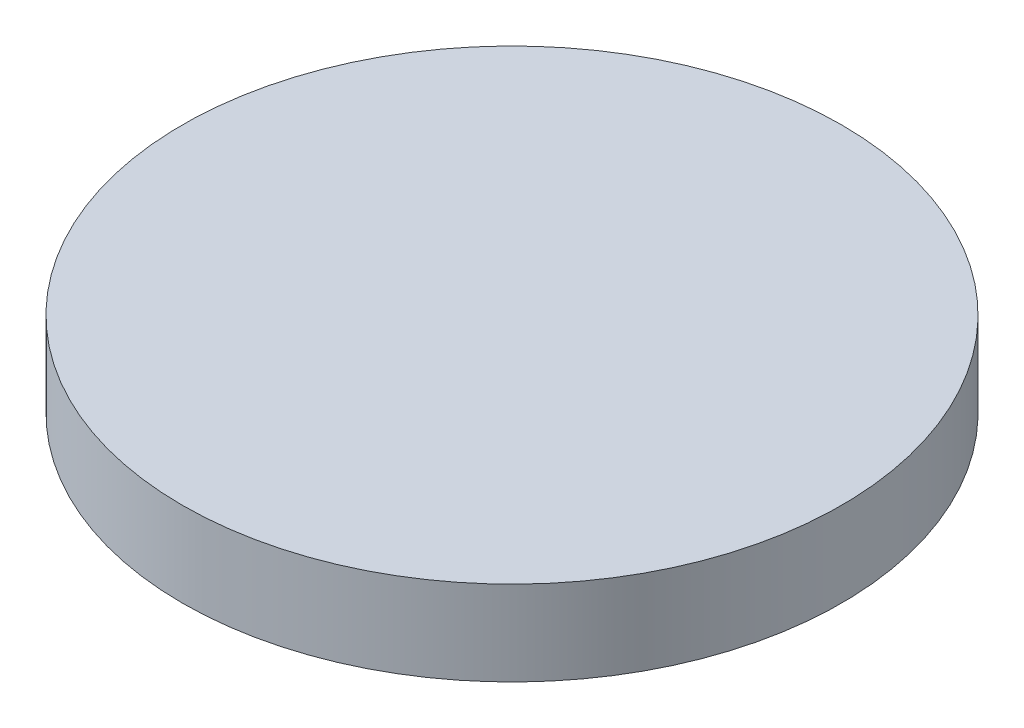
ISO-10303-21;
HEADER;
FILE_DESCRIPTION(('STEP AP214'),'2;1');
FILE_NAME('part.step','',(''),(''),'','','');
FILE_SCHEMA(('AUTOMOTIVE_DESIGN { 1 0 10303 214 1 1 1 1 }'));
ENDSEC;
DATA;
#1=APPLICATION_CONTEXT('core data for automotive mechanical design processes');
#2=APPLICATION_PROTOCOL_DEFINITION('international standard','automotive_design',2000,#1);
#3=PRODUCT_CONTEXT('',#1,'mechanical');
#4=PRODUCT('Part','Part','',(#3));
#5=PRODUCT_RELATED_PRODUCT_CATEGORY('part','',(#4));
#6=PRODUCT_DEFINITION_FORMATION('','',#4);
#7=PRODUCT_DEFINITION_CONTEXT('part definition',#1,'design');
#8=PRODUCT_DEFINITION('design','',#6,#7);
#9=PRODUCT_DEFINITION_SHAPE('','',#8);
#10=(LENGTH_UNIT() NAMED_UNIT(*) SI_UNIT(.MILLI.,.METRE.));
#11=(NAMED_UNIT(*) PLANE_ANGLE_UNIT() SI_UNIT($,.RADIAN.));
#12=(NAMED_UNIT(*) SI_UNIT($,.STERADIAN.) SOLID_ANGLE_UNIT());
#13=UNCERTAINTY_MEASURE_WITH_UNIT(LENGTH_MEASURE(1.E-05),#10,'distance_accuracy_value','');
#14=(GEOMETRIC_REPRESENTATION_CONTEXT(3) GLOBAL_UNCERTAINTY_ASSIGNED_CONTEXT((#13)) GLOBAL_UNIT_ASSIGNED_CONTEXT((#10,
#11,#12)) REPRESENTATION_CONTEXT('',''));
#15=CARTESIAN_POINT('',(0.,0.,0.));
#16=DIRECTION('',(0.,0.,1.));
#17=DIRECTION('',(1.,0.,0.));
#18=AXIS2_PLACEMENT_3D('',#15,#16,#17);
#19=CARTESIAN_POINT('',(0.,-3.,0.));
#20=DIRECTION('',(0.,1.,0.));
#21=DIRECTION('',(0.,0.,1.));
#22=AXIS2_PLACEMENT_3D('',#19,#20,#21);
#23=CYLINDRICAL_SURFACE('',#22,16.5);
#24=CARTESIAN_POINT('',(0.,-3.,0.));
#25=DIRECTION('',(0.,-1.,0.));
#26=DIRECTION('',(0.,0.,-1.));
#27=AXIS2_PLACEMENT_3D('',#24,#25,#26);
#28=CIRCLE('',#27,16.5);
#29=CARTESIAN_POINT('',(0.,-3.,-16.5));
#30=VERTEX_POINT('',#29);
#31=EDGE_CURVE('E300',#30,#30,#28,.T.);
#32=ORIENTED_EDGE('',*,*,#31,.T.);
#33=EDGE_LOOP('',(#32));
#34=FACE_BOUND('',#33,.T.);
#35=CARTESIAN_POINT('',(0.,0.,0.));
#36=DIRECTION('',(0.,-1.,0.));
#37=DIRECTION('',(0.,0.,-1.));
#38=AXIS2_PLACEMENT_3D('',#35,#36,#37);
#39=CIRCLE('',#38,16.5);
#40=CARTESIAN_POINT('',(16.4924225024706,0.,0.499999999999942));
#41=VERTEX_POINT('',#40);
#42=CARTESIAN_POINT('',(0.5,0.,16.4924225024706));
#43=VERTEX_POINT('',#42);
#44=EDGE_CURVE('E305',#41,#43,#39,.T.);
#45=ORIENTED_EDGE('',*,*,#44,.F.);
#46=DIRECTION('',(0.,1.,0.));
#47=VECTOR('',#46,1.);
#48=CARTESIAN_POINT('',(16.4924225024706,-3.,0.499999999999942));
#49=LINE('',#48,#47);
#50=CARTESIAN_POINT('',(16.4924225024706,-0.5,0.499999999999942));
#51=VERTEX_POINT('',#50);
#52=EDGE_CURVE('E234',#51,#41,#49,.T.);
#53=ORIENTED_EDGE('',*,*,#52,.F.);
#54=CARTESIAN_POINT('',(0.,-0.5,0.));
#55=DIRECTION('',(0.,-1.,0.));
#56=DIRECTION('',(-1.,0.,0.));
#57=AXIS2_PLACEMENT_3D('',#54,#55,#56);
#58=CIRCLE('',#57,16.5);
#59=CARTESIAN_POINT('',(16.4924225024706,-0.5,-0.500000000000058));
#60=VERTEX_POINT('',#59);
#61=EDGE_CURVE('E236',#60,#51,#58,.T.);
#62=ORIENTED_EDGE('',*,*,#61,.F.);
#63=DIRECTION('',(0.,1.,0.));
#64=VECTOR('',#63,1.);
#65=CARTESIAN_POINT('',(16.4924225024706,-3.,-0.500000000000058));
#66=LINE('',#65,#64);
#67=CARTESIAN_POINT('',(16.4924225024706,0.,-0.500000000000058));
#68=VERTEX_POINT('',#67);
#69=EDGE_CURVE('E227',#60,#68,#66,.T.);
#70=ORIENTED_EDGE('',*,*,#69,.T.);
#71=CARTESIAN_POINT('',(0.5,0.,-16.4924225024706));
#72=VERTEX_POINT('',#71);
#73=EDGE_CURVE('E70',#72,#68,#39,.T.);
#74=ORIENTED_EDGE('',*,*,#73,.F.);
#75=DIRECTION('',(0.,1.,0.));
#76=VECTOR('',#75,1.);
#77=CARTESIAN_POINT('',(0.5,-3.,-16.4924225024706));
#78=LINE('',#77,#76);
#79=CARTESIAN_POINT('',(0.5,-0.5,-16.4924225024706));
#80=VERTEX_POINT('',#79);
#81=EDGE_CURVE('E253',#80,#72,#78,.T.);
#82=ORIENTED_EDGE('',*,*,#81,.F.);
#83=CARTESIAN_POINT('',(0.,-0.5,0.));
#84=DIRECTION('',(0.,1.,0.));
#85=DIRECTION('',(0.,0.,1.));
#86=AXIS2_PLACEMENT_3D('',#83,#84,#85);
#87=CIRCLE('',#86,16.5);
#88=CARTESIAN_POINT('',(-0.5,-0.5,-16.4924225024706));
#89=VERTEX_POINT('',#88);
#90=EDGE_CURVE('E266',#80,#89,#87,.T.);
#91=ORIENTED_EDGE('',*,*,#90,.T.);
#92=DIRECTION('',(0.,1.,0.));
#93=VECTOR('',#92,1.);
#94=CARTESIAN_POINT('',(-0.5,-3.,-16.4924225024706));
#95=LINE('',#94,#93);
#96=CARTESIAN_POINT('',(-0.5,0.,-16.4924225024706));
#97=VERTEX_POINT('',#96);
#98=EDGE_CURVE('E263',#89,#97,#95,.T.);
#99=ORIENTED_EDGE('',*,*,#98,.T.);
#100=CARTESIAN_POINT('',(-16.4924225024706,0.,-0.499999999999942));
#101=VERTEX_POINT('',#100);
#102=EDGE_CURVE('E302',#101,#97,#39,.T.);
#103=ORIENTED_EDGE('',*,*,#102,.F.);
#104=DIRECTION('',(0.,1.,0.));
#105=VECTOR('',#104,1.);
#106=CARTESIAN_POINT('',(-16.4924225024706,-3.,-0.499999999999942));
#107=LINE('',#106,#105);
#108=CARTESIAN_POINT('',(-16.4924225024706,-0.5,-0.499999999999942));
#109=VERTEX_POINT('',#108);
#110=EDGE_CURVE('E205',#109,#101,#107,.T.);
#111=ORIENTED_EDGE('',*,*,#110,.F.);
#112=CARTESIAN_POINT('',(0.,-0.5,0.));
#113=DIRECTION('',(0.,1.,0.));
#114=DIRECTION('',(1.,0.,0.));
#115=AXIS2_PLACEMENT_3D('',#112,#113,#114);
#116=CIRCLE('',#115,16.5);
#117=CARTESIAN_POINT('',(-16.4924225024706,-0.5,0.500000000000058));
#118=VERTEX_POINT('',#117);
#119=EDGE_CURVE('E211',#109,#118,#116,.T.);
#120=ORIENTED_EDGE('',*,*,#119,.T.);
#121=DIRECTION('',(0.,1.,0.));
#122=VECTOR('',#121,1.);
#123=CARTESIAN_POINT('',(-16.4924225024706,-3.,0.500000000000058));
#124=LINE('',#123,#122);
#125=CARTESIAN_POINT('',(-16.4924225024706,0.,0.500000000000058));
#126=VERTEX_POINT('',#125);
#127=EDGE_CURVE('E209',#118,#126,#124,.T.);
#128=ORIENTED_EDGE('',*,*,#127,.T.);
#129=CARTESIAN_POINT('',(-0.5,0.,16.4924225024706));
#130=VERTEX_POINT('',#129);
#131=EDGE_CURVE('E65',#130,#126,#39,.T.);
#132=ORIENTED_EDGE('',*,*,#131,.F.);
#133=DIRECTION('',(0.,1.,0.));
#134=VECTOR('',#133,1.);
#135=CARTESIAN_POINT('',(-0.5,-3.,16.4924225024706));
#136=LINE('',#135,#134);
#137=CARTESIAN_POINT('',(-0.5,-0.5,16.4924225024706));
#138=VERTEX_POINT('',#137);
#139=EDGE_CURVE('E293',#138,#130,#136,.T.);
#140=ORIENTED_EDGE('',*,*,#139,.F.);
#141=CARTESIAN_POINT('',(0.,-0.5,0.));
#142=DIRECTION('',(0.,-1.,0.));
#143=DIRECTION('',(0.,0.,-1.));
#144=AXIS2_PLACEMENT_3D('',#141,#142,#143);
#145=CIRCLE('',#144,16.5);
#146=CARTESIAN_POINT('',(0.5,-0.5,16.4924225024706));
#147=VERTEX_POINT('',#146);
#148=EDGE_CURVE('E12',#147,#138,#145,.T.);
#149=ORIENTED_EDGE('',*,*,#148,.F.);
#150=DIRECTION('',(0.,1.,0.));
#151=VECTOR('',#150,1.);
#152=CARTESIAN_POINT('',(0.5,-3.,16.4924225024706));
#153=LINE('',#152,#151);
#154=EDGE_CURVE('E285',#147,#43,#153,.T.);
#155=ORIENTED_EDGE('',*,*,#154,.T.);
#156=EDGE_LOOP('',(#45,#53,#62,#70,#74,#82,#91,#99,#103,#111,#120,#128,#132,#140,#149,#155));
#157=FACE_BOUND('',#156,.T.);
#158=ADVANCED_FACE('F61',(#34,#157),#23,.F.);
#159=CARTESIAN_POINT('',(0.,1.5,0.));
#160=DIRECTION('',(0.,-1.,0.));
#161=DIRECTION('',(0.,0.,-1.));
#162=AXIS2_PLACEMENT_3D('',#159,#160,#161);
#163=CYLINDRICAL_SURFACE('',#162,17.5);
#164=CARTESIAN_POINT('',(0.,-3.,0.));
#165=DIRECTION('',(0.,-1.,0.));
#166=DIRECTION('',(0.,0.,-1.));
#167=AXIS2_PLACEMENT_3D('',#164,#165,#166);
#168=CIRCLE('',#167,17.5);
#169=CARTESIAN_POINT('',(0.,-3.,-17.5));
#170=VERTEX_POINT('',#169);
#171=EDGE_CURVE('E295',#170,#170,#168,.T.);
#172=ORIENTED_EDGE('',*,*,#171,.F.);
#173=EDGE_LOOP('',(#172));
#174=FACE_BOUND('',#173,.T.);
#175=CARTESIAN_POINT('',(0.,1.5,0.));
#176=DIRECTION('',(0.,1.,0.));
#177=DIRECTION('',(0.,0.,1.));
#178=AXIS2_PLACEMENT_3D('',#175,#176,#177);
#179=CIRCLE('',#178,17.5);
#180=CARTESIAN_POINT('',(0.,1.5,17.5));
#181=VERTEX_POINT('',#180);
#182=EDGE_CURVE('E269',#181,#181,#179,.T.);
#183=ORIENTED_EDGE('',*,*,#182,.F.);
#184=EDGE_LOOP('',(#183));
#185=FACE_BOUND('',#184,.T.);
#186=ADVANCED_FACE('F366',(#174,#185),#163,.T.);
#187=CARTESIAN_POINT('',(0.,1.5,0.));
#188=DIRECTION('',(0.,1.,0.));
#189=DIRECTION('',(0.,0.,1.));
#190=AXIS2_PLACEMENT_3D('',#187,#188,#189);
#191=PLANE('',#190);
#192=ORIENTED_EDGE('',*,*,#182,.T.);
#193=EDGE_LOOP('',(#192));
#194=FACE_BOUND('',#193,.T.);
#195=ADVANCED_FACE('F63',(#194),#191,.T.);
#196=CARTESIAN_POINT('',(0.,-3.,0.));
#197=DIRECTION('',(0.,-1.,0.));
#198=DIRECTION('',(0.,0.,-1.));
#199=AXIS2_PLACEMENT_3D('',#196,#197,#198);
#200=PLANE('',#199);
#201=ORIENTED_EDGE('',*,*,#171,.T.);
#202=EDGE_LOOP('',(#201));
#203=FACE_BOUND('',#202,.T.);
#204=ORIENTED_EDGE('',*,*,#31,.F.);
#205=EDGE_LOOP('',(#204));
#206=FACE_BOUND('',#205,.T.);
#207=ADVANCED_FACE('F378',(#203,#206),#200,.T.);
#208=CARTESIAN_POINT('',(0.,0.,0.));
#209=DIRECTION('',(0.,1.,0.));
#210=DIRECTION('',(0.,0.,1.));
#211=AXIS2_PLACEMENT_3D('',#208,#209,#210);
#212=PLANE('',#211);
#213=ORIENTED_EDGE('',*,*,#131,.T.);
#214=DIRECTION('',(1.,0.,0.));
#215=VECTOR('',#214,1.);
#216=CARTESIAN_POINT('',(-16.5,0.,0.500000000000058));
#217=LINE('',#216,#215);
#218=CARTESIAN_POINT('',(-15.,0.,0.500000000000052));
#219=VERTEX_POINT('',#218);
#220=EDGE_CURVE('E181',#126,#219,#217,.T.);
#221=ORIENTED_EDGE('',*,*,#220,.T.);
#222=DIRECTION('',(0.,0.,1.));
#223=VECTOR('',#222,1.);
#224=CARTESIAN_POINT('',(-15.,0.,-0.499999999999948));
#225=LINE('',#224,#223);
#226=CARTESIAN_POINT('',(-15.,0.,-0.499999999999948));
#227=VERTEX_POINT('',#226);
#228=EDGE_CURVE('E190',#227,#219,#225,.T.);
#229=ORIENTED_EDGE('',*,*,#228,.F.);
#230=DIRECTION('',(1.,0.,0.));
#231=VECTOR('',#230,1.);
#232=CARTESIAN_POINT('',(-16.5,0.,-0.499999999999942));
#233=LINE('',#232,#231);
#234=EDGE_CURVE('E86',#101,#227,#233,.T.);
#235=ORIENTED_EDGE('',*,*,#234,.F.);
#236=ORIENTED_EDGE('',*,*,#102,.T.);
#237=DIRECTION('',(0.,0.,1.));
#238=VECTOR('',#237,1.);
#239=CARTESIAN_POINT('',(-0.5,0.,-16.5));
#240=LINE('',#239,#238);
#241=CARTESIAN_POINT('',(-0.5,0.,-15.));
#242=VERTEX_POINT('',#241);
#243=EDGE_CURVE('E243',#97,#242,#240,.T.);
#244=ORIENTED_EDGE('',*,*,#243,.T.);
#245=DIRECTION('',(-1.,0.,0.));
#246=VECTOR('',#245,1.);
#247=CARTESIAN_POINT('',(0.5,0.,-15.));
#248=LINE('',#247,#246);
#249=CARTESIAN_POINT('',(0.5,0.,-15.));
#250=VERTEX_POINT('',#249);
#251=EDGE_CURVE('E246',#250,#242,#248,.T.);
#252=ORIENTED_EDGE('',*,*,#251,.F.);
#253=DIRECTION('',(0.,0.,1.));
#254=VECTOR('',#253,1.);
#255=CARTESIAN_POINT('',(0.5,0.,-16.5));
#256=LINE('',#255,#254);
#257=EDGE_CURVE('E250',#72,#250,#256,.T.);
#258=ORIENTED_EDGE('',*,*,#257,.F.);
#259=ORIENTED_EDGE('',*,*,#73,.T.);
#260=DIRECTION('',(-1.,0.,0.));
#261=VECTOR('',#260,1.);
#262=CARTESIAN_POINT('',(16.5,0.,-0.500000000000058));
#263=LINE('',#262,#261);
#264=CARTESIAN_POINT('',(15.,0.,-0.500000000000053));
#265=VERTEX_POINT('',#264);
#266=EDGE_CURVE('E224',#68,#265,#263,.T.);
#267=ORIENTED_EDGE('',*,*,#266,.T.);
#268=DIRECTION('',(0.,0.,1.));
#269=VECTOR('',#268,1.);
#270=CARTESIAN_POINT('',(15.,0.,-0.500000000000053));
#271=LINE('',#270,#269);
#272=CARTESIAN_POINT('',(15.,0.,0.499999999999947));
#273=VERTEX_POINT('',#272);
#274=EDGE_CURVE('E220',#265,#273,#271,.T.);
#275=ORIENTED_EDGE('',*,*,#274,.T.);
#276=DIRECTION('',(-1.,0.,0.));
#277=VECTOR('',#276,1.);
#278=CARTESIAN_POINT('',(16.5,0.,0.499999999999942));
#279=LINE('',#278,#277);
#280=EDGE_CURVE('E218',#41,#273,#279,.T.);
#281=ORIENTED_EDGE('',*,*,#280,.F.);
#282=ORIENTED_EDGE('',*,*,#44,.T.);
#283=DIRECTION('',(0.,0.,-1.));
#284=VECTOR('',#283,1.);
#285=CARTESIAN_POINT('',(0.5,0.,16.5));
#286=LINE('',#285,#284);
#287=CARTESIAN_POINT('',(0.5,0.,15.));
#288=VERTEX_POINT('',#287);
#289=EDGE_CURVE('E283',#43,#288,#286,.T.);
#290=ORIENTED_EDGE('',*,*,#289,.T.);
#291=DIRECTION('',(-1.,0.,0.));
#292=VECTOR('',#291,1.);
#293=CARTESIAN_POINT('',(0.5,0.,15.));
#294=LINE('',#293,#292);
#295=CARTESIAN_POINT('',(-0.5,0.,15.));
#296=VERTEX_POINT('',#295);
#297=EDGE_CURVE('E279',#288,#296,#294,.T.);
#298=ORIENTED_EDGE('',*,*,#297,.T.);
#299=DIRECTION('',(0.,0.,-1.));
#300=VECTOR('',#299,1.);
#301=CARTESIAN_POINT('',(-0.5,0.,16.5));
#302=LINE('',#301,#300);
#303=EDGE_CURVE('E277',#130,#296,#302,.T.);
#304=ORIENTED_EDGE('',*,*,#303,.F.);
#305=EDGE_LOOP('',(#213,#221,#229,#235,#236,#244,#252,#258,#259,#267,#275,#281,#282,#290,#298,#304));
#306=FACE_BOUND('',#305,.T.);
#307=ADVANCED_FACE('F195',(#306),#212,.F.);
#308=CARTESIAN_POINT('',(0.,-0.5,0.));
#309=DIRECTION('',(0.,1.,0.));
#310=DIRECTION('',(0.,0.,1.));
#311=AXIS2_PLACEMENT_3D('',#308,#309,#310);
#312=PLANE('',#311);
#313=DIRECTION('',(0.,0.,-1.));
#314=VECTOR('',#313,1.);
#315=CARTESIAN_POINT('',(0.5,-0.5,16.5));
#316=LINE('',#315,#314);
#317=CARTESIAN_POINT('',(0.5,-0.5,15.));
#318=VERTEX_POINT('',#317);
#319=EDGE_CURVE('E280',#147,#318,#316,.T.);
#320=ORIENTED_EDGE('',*,*,#319,.F.);
#321=ORIENTED_EDGE('',*,*,#148,.T.);
#322=DIRECTION('',(0.,0.,-1.));
#323=VECTOR('',#322,1.);
#324=CARTESIAN_POINT('',(-0.5,-0.5,16.5));
#325=LINE('',#324,#323);
#326=CARTESIAN_POINT('',(-0.5,-0.5,15.));
#327=VERTEX_POINT('',#326);
#328=EDGE_CURVE('E273',#138,#327,#325,.T.);
#329=ORIENTED_EDGE('',*,*,#328,.T.);
#330=DIRECTION('',(-1.,0.,0.));
#331=VECTOR('',#330,1.);
#332=CARTESIAN_POINT('',(0.5,-0.5,15.));
#333=LINE('',#332,#331);
#334=EDGE_CURVE('E287',#318,#327,#333,.T.);
#335=ORIENTED_EDGE('',*,*,#334,.F.);
#336=EDGE_LOOP('',(#320,#321,#329,#335));
#337=FACE_BOUND('',#336,.T.);
#338=ADVANCED_FACE('F375',(#337),#312,.F.);
#339=CARTESIAN_POINT('',(0.5,-0.5,15.));
#340=DIRECTION('',(0.,0.,-1.));
#341=DIRECTION('',(-1.,0.,0.));
#342=AXIS2_PLACEMENT_3D('',#339,#340,#341);
#343=PLANE('',#342);
#344=ORIENTED_EDGE('',*,*,#297,.F.);
#345=DIRECTION('',(0.,1.,0.));
#346=VECTOR('',#345,1.);
#347=CARTESIAN_POINT('',(0.5,-0.5,15.));
#348=LINE('',#347,#346);
#349=EDGE_CURVE('E270',#318,#288,#348,.T.);
#350=ORIENTED_EDGE('',*,*,#349,.F.);
#351=ORIENTED_EDGE('',*,*,#334,.T.);
#352=DIRECTION('',(0.,1.,0.));
#353=VECTOR('',#352,1.);
#354=CARTESIAN_POINT('',(-0.5,-0.5,15.));
#355=LINE('',#354,#353);
#356=EDGE_CURVE('E274',#327,#296,#355,.T.);
#357=ORIENTED_EDGE('',*,*,#356,.T.);
#358=EDGE_LOOP('',(#344,#350,#351,#357));
#359=FACE_BOUND('',#358,.T.);
#360=ADVANCED_FACE('F323',(#359),#343,.T.);
#361=CARTESIAN_POINT('',(-0.5,-0.5,16.5));
#362=DIRECTION('',(1.,0.,0.));
#363=DIRECTION('',(0.,0.,-1.));
#364=AXIS2_PLACEMENT_3D('',#361,#362,#363);
#365=PLANE('',#364);
#366=ORIENTED_EDGE('',*,*,#328,.F.);
#367=ORIENTED_EDGE('',*,*,#139,.T.);
#368=ORIENTED_EDGE('',*,*,#303,.T.);
#369=ORIENTED_EDGE('',*,*,#356,.F.);
#370=EDGE_LOOP('',(#366,#367,#368,#369));
#371=FACE_BOUND('',#370,.T.);
#372=ADVANCED_FACE('F327',(#371),#365,.F.);
#373=CARTESIAN_POINT('',(0.5,-0.5,16.5));
#374=DIRECTION('',(1.,0.,0.));
#375=DIRECTION('',(0.,0.,-1.));
#376=AXIS2_PLACEMENT_3D('',#373,#374,#375);
#377=PLANE('',#376);
#378=ORIENTED_EDGE('',*,*,#154,.F.);
#379=ORIENTED_EDGE('',*,*,#319,.T.);
#380=ORIENTED_EDGE('',*,*,#349,.T.);
#381=ORIENTED_EDGE('',*,*,#289,.F.);
#382=EDGE_LOOP('',(#378,#379,#380,#381));
#383=FACE_BOUND('',#382,.T.);
#384=ADVANCED_FACE('F318',(#383),#377,.T.);
#385=CARTESIAN_POINT('',(0.,-0.5,0.));
#386=DIRECTION('',(0.,1.,0.));
#387=DIRECTION('',(0.,0.,-1.));
#388=AXIS2_PLACEMENT_3D('',#385,#386,#387);
#389=PLANE('',#388);
#390=DIRECTION('',(0.,0.,1.));
#391=VECTOR('',#390,1.);
#392=CARTESIAN_POINT('',(0.5,-0.5,-16.5));
#393=LINE('',#392,#391);
#394=CARTESIAN_POINT('',(0.5,-0.5,-15.));
#395=VERTEX_POINT('',#394);
#396=EDGE_CURVE('E247',#80,#395,#393,.T.);
#397=ORIENTED_EDGE('',*,*,#396,.T.);
#398=DIRECTION('',(-1.,0.,0.));
#399=VECTOR('',#398,1.);
#400=CARTESIAN_POINT('',(0.5,-0.5,-15.));
#401=LINE('',#400,#399);
#402=CARTESIAN_POINT('',(-0.5,-0.5,-15.));
#403=VERTEX_POINT('',#402);
#404=EDGE_CURVE('E256',#395,#403,#401,.T.);
#405=ORIENTED_EDGE('',*,*,#404,.T.);
#406=DIRECTION('',(0.,0.,1.));
#407=VECTOR('',#406,1.);
#408=CARTESIAN_POINT('',(-0.5,-0.5,-16.5));
#409=LINE('',#408,#407);
#410=EDGE_CURVE('E241',#89,#403,#409,.T.);
#411=ORIENTED_EDGE('',*,*,#410,.F.);
#412=ORIENTED_EDGE('',*,*,#90,.F.);
#413=EDGE_LOOP('',(#397,#405,#411,#412));
#414=FACE_BOUND('',#413,.T.);
#415=ADVANCED_FACE('F438',(#414),#389,.F.);
#416=CARTESIAN_POINT('',(0.5,-0.5,-15.));
#417=DIRECTION('',(0.,0.,1.));
#418=DIRECTION('',(-1.,0.,0.));
#419=AXIS2_PLACEMENT_3D('',#416,#417,#418);
#420=PLANE('',#419);
#421=ORIENTED_EDGE('',*,*,#251,.T.);
#422=DIRECTION('',(0.,1.,0.));
#423=VECTOR('',#422,1.);
#424=CARTESIAN_POINT('',(-0.5,-0.5,-15.));
#425=LINE('',#424,#423);
#426=EDGE_CURVE('E238',#403,#242,#425,.T.);
#427=ORIENTED_EDGE('',*,*,#426,.F.);
#428=ORIENTED_EDGE('',*,*,#404,.F.);
#429=DIRECTION('',(0.,1.,0.));
#430=VECTOR('',#429,1.);
#431=CARTESIAN_POINT('',(0.5,-0.5,-15.));
#432=LINE('',#431,#430);
#433=EDGE_CURVE('E239',#395,#250,#432,.T.);
#434=ORIENTED_EDGE('',*,*,#433,.T.);
#435=EDGE_LOOP('',(#421,#427,#428,#434));
#436=FACE_BOUND('',#435,.T.);
#437=ADVANCED_FACE('F341',(#436),#420,.T.);
#438=CARTESIAN_POINT('',(-0.5,-0.5,-16.5));
#439=DIRECTION('',(1.,0.,0.));
#440=DIRECTION('',(0.,0.,1.));
#441=AXIS2_PLACEMENT_3D('',#438,#439,#440);
#442=PLANE('',#441);
#443=ORIENTED_EDGE('',*,*,#410,.T.);
#444=ORIENTED_EDGE('',*,*,#426,.T.);
#445=ORIENTED_EDGE('',*,*,#243,.F.);
#446=ORIENTED_EDGE('',*,*,#98,.F.);
#447=EDGE_LOOP('',(#443,#444,#445,#446));
#448=FACE_BOUND('',#447,.T.);
#449=ADVANCED_FACE('F337',(#448),#442,.F.);
#450=CARTESIAN_POINT('',(0.5,-0.5,-16.5));
#451=DIRECTION('',(1.,0.,0.));
#452=DIRECTION('',(0.,0.,1.));
#453=AXIS2_PLACEMENT_3D('',#450,#451,#452);
#454=PLANE('',#453);
#455=ORIENTED_EDGE('',*,*,#81,.T.);
#456=ORIENTED_EDGE('',*,*,#257,.T.);
#457=ORIENTED_EDGE('',*,*,#433,.F.);
#458=ORIENTED_EDGE('',*,*,#396,.F.);
#459=EDGE_LOOP('',(#455,#456,#457,#458));
#460=FACE_BOUND('',#459,.T.);
#461=ADVANCED_FACE('F344',(#460),#454,.T.);
#462=CARTESIAN_POINT('',(-15.,-0.5,-0.499999999999948));
#463=DIRECTION('',(1.,0.,0.));
#464=DIRECTION('',(0.,0.,1.));
#465=AXIS2_PLACEMENT_3D('',#462,#463,#464);
#466=PLANE('',#465);
#467=ORIENTED_EDGE('',*,*,#228,.T.);
#468=DIRECTION('',(0.,1.,0.));
#469=VECTOR('',#468,1.);
#470=CARTESIAN_POINT('',(-15.,-0.5,0.500000000000052));
#471=LINE('',#470,#469);
#472=CARTESIAN_POINT('',(-15.,-0.5,0.500000000000052));
#473=VERTEX_POINT('',#472);
#474=EDGE_CURVE('E176',#473,#219,#471,.T.);
#475=ORIENTED_EDGE('',*,*,#474,.F.);
#476=DIRECTION('',(0.,0.,1.));
#477=VECTOR('',#476,1.);
#478=CARTESIAN_POINT('',(-15.,-0.5,-0.499999999999948));
#479=LINE('',#478,#477);
#480=CARTESIAN_POINT('',(-15.,-0.5,-0.499999999999948));
#481=VERTEX_POINT('',#480);
#482=EDGE_CURVE('E200',#481,#473,#479,.T.);
#483=ORIENTED_EDGE('',*,*,#482,.F.);
#484=DIRECTION('',(0.,1.,0.));
#485=VECTOR('',#484,1.);
#486=CARTESIAN_POINT('',(-15.,-0.5,-0.499999999999948));
#487=LINE('',#486,#485);
#488=EDGE_CURVE('E187',#481,#227,#487,.T.);
#489=ORIENTED_EDGE('',*,*,#488,.T.);
#490=EDGE_LOOP('',(#467,#475,#483,#489));
#491=FACE_BOUND('',#490,.T.);
#492=ADVANCED_FACE('F191',(#491),#466,.T.);
#493=CARTESIAN_POINT('',(-16.5,-0.5,-0.499999999999942));
#494=DIRECTION('',(0.,0.,-1.));
#495=DIRECTION('',(1.,0.,0.));
#496=AXIS2_PLACEMENT_3D('',#493,#494,#495);
#497=PLANE('',#496);
#498=ORIENTED_EDGE('',*,*,#110,.T.);
#499=ORIENTED_EDGE('',*,*,#234,.T.);
#500=ORIENTED_EDGE('',*,*,#488,.F.);
#501=DIRECTION('',(1.,0.,0.));
#502=VECTOR('',#501,1.);
#503=CARTESIAN_POINT('',(-16.5,-0.5,-0.499999999999942));
#504=LINE('',#503,#502);
#505=EDGE_CURVE('E197',#109,#481,#504,.T.);
#506=ORIENTED_EDGE('',*,*,#505,.F.);
#507=EDGE_LOOP('',(#498,#499,#500,#506));
#508=FACE_BOUND('',#507,.T.);
#509=ADVANCED_FACE('F332',(#508),#497,.T.);
#510=CARTESIAN_POINT('',(-16.5,-0.5,0.500000000000058));
#511=DIRECTION('',(0.,0.,-1.));
#512=DIRECTION('',(1.,0.,0.));
#513=AXIS2_PLACEMENT_3D('',#510,#511,#512);
#514=PLANE('',#513);
#515=DIRECTION('',(1.,0.,0.));
#516=VECTOR('',#515,1.);
#517=CARTESIAN_POINT('',(-16.5,-0.5,0.500000000000058));
#518=LINE('',#517,#516);
#519=EDGE_CURVE('E183',#118,#473,#518,.T.);
#520=ORIENTED_EDGE('',*,*,#519,.T.);
#521=ORIENTED_EDGE('',*,*,#474,.T.);
#522=ORIENTED_EDGE('',*,*,#220,.F.);
#523=ORIENTED_EDGE('',*,*,#127,.F.);
#524=EDGE_LOOP('',(#520,#521,#522,#523));
#525=FACE_BOUND('',#524,.T.);
#526=ADVANCED_FACE('F178',(#525),#514,.F.);
#527=CARTESIAN_POINT('',(0.,-0.5,0.));
#528=DIRECTION('',(0.,1.,0.));
#529=DIRECTION('',(-1.,0.,0.));
#530=AXIS2_PLACEMENT_3D('',#527,#528,#529);
#531=PLANE('',#530);
#532=ORIENTED_EDGE('',*,*,#505,.T.);
#533=ORIENTED_EDGE('',*,*,#482,.T.);
#534=ORIENTED_EDGE('',*,*,#519,.F.);
#535=ORIENTED_EDGE('',*,*,#119,.F.);
#536=EDGE_LOOP('',(#532,#533,#534,#535));
#537=FACE_BOUND('',#536,.T.);
#538=ADVANCED_FACE('F331',(#537),#531,.F.);
#539=CARTESIAN_POINT('',(0.,-0.5,0.));
#540=DIRECTION('',(0.,1.,0.));
#541=DIRECTION('',(1.,0.,0.));
#542=AXIS2_PLACEMENT_3D('',#539,#540,#541);
#543=PLANE('',#542);
#544=DIRECTION('',(-1.,0.,0.));
#545=VECTOR('',#544,1.);
#546=CARTESIAN_POINT('',(16.5,-0.5,-0.500000000000058));
#547=LINE('',#546,#545);
#548=CARTESIAN_POINT('',(15.,-0.5,-0.500000000000053));
#549=VERTEX_POINT('',#548);
#550=EDGE_CURVE('E221',#60,#549,#547,.T.);
#551=ORIENTED_EDGE('',*,*,#550,.F.);
#552=ORIENTED_EDGE('',*,*,#61,.T.);
#553=DIRECTION('',(-1.,0.,0.));
#554=VECTOR('',#553,1.);
#555=CARTESIAN_POINT('',(16.5,-0.5,0.499999999999942));
#556=LINE('',#555,#554);
#557=CARTESIAN_POINT('',(15.,-0.5,0.499999999999947));
#558=VERTEX_POINT('',#557);
#559=EDGE_CURVE('E216',#51,#558,#556,.T.);
#560=ORIENTED_EDGE('',*,*,#559,.T.);
#561=DIRECTION('',(0.,0.,1.));
#562=VECTOR('',#561,1.);
#563=CARTESIAN_POINT('',(15.,-0.5,-0.500000000000053));
#564=LINE('',#563,#562);
#565=EDGE_CURVE('E229',#549,#558,#564,.T.);
#566=ORIENTED_EDGE('',*,*,#565,.F.);
#567=EDGE_LOOP('',(#551,#552,#560,#566));
#568=FACE_BOUND('',#567,.T.);
#569=ADVANCED_FACE('F354',(#568),#543,.F.);
#570=CARTESIAN_POINT('',(15.,-0.5,-0.500000000000053));
#571=DIRECTION('',(-1.,0.,0.));
#572=DIRECTION('',(0.,0.,1.));
#573=AXIS2_PLACEMENT_3D('',#570,#571,#572);
#574=PLANE('',#573);
#575=ORIENTED_EDGE('',*,*,#274,.F.);
#576=DIRECTION('',(0.,1.,0.));
#577=VECTOR('',#576,1.);
#578=CARTESIAN_POINT('',(15.,-0.5,-0.500000000000053));
#579=LINE('',#578,#577);
#580=EDGE_CURVE('E214',#549,#265,#579,.T.);
#581=ORIENTED_EDGE('',*,*,#580,.F.);
#582=ORIENTED_EDGE('',*,*,#565,.T.);
#583=DIRECTION('',(0.,1.,0.));
#584=VECTOR('',#583,1.);
#585=CARTESIAN_POINT('',(15.,-0.5,0.499999999999947));
#586=LINE('',#585,#584);
#587=EDGE_CURVE('E78',#558,#273,#586,.T.);
#588=ORIENTED_EDGE('',*,*,#587,.T.);
#589=EDGE_LOOP('',(#575,#581,#582,#588));
#590=FACE_BOUND('',#589,.T.);
#591=ADVANCED_FACE('F351',(#590),#574,.T.);
#592=CARTESIAN_POINT('',(16.5,-0.5,0.499999999999942));
#593=DIRECTION('',(0.,0.,-1.));
#594=DIRECTION('',(-1.,0.,0.));
#595=AXIS2_PLACEMENT_3D('',#592,#593,#594);
#596=PLANE('',#595);
#597=ORIENTED_EDGE('',*,*,#559,.F.);
#598=ORIENTED_EDGE('',*,*,#52,.T.);
#599=ORIENTED_EDGE('',*,*,#280,.T.);
#600=ORIENTED_EDGE('',*,*,#587,.F.);
#601=EDGE_LOOP('',(#597,#598,#599,#600));
#602=FACE_BOUND('',#601,.T.);
#603=ADVANCED_FACE('F353',(#602),#596,.F.);
#604=CARTESIAN_POINT('',(16.5,-0.5,-0.500000000000058));
#605=DIRECTION('',(0.,0.,-1.));
#606=DIRECTION('',(-1.,0.,0.));
#607=AXIS2_PLACEMENT_3D('',#604,#605,#606);
#608=PLANE('',#607);
#609=ORIENTED_EDGE('',*,*,#69,.F.);
#610=ORIENTED_EDGE('',*,*,#550,.T.);
#611=ORIENTED_EDGE('',*,*,#580,.T.);
#612=ORIENTED_EDGE('',*,*,#266,.F.);
#613=EDGE_LOOP('',(#609,#610,#611,#612));
#614=FACE_BOUND('',#613,.T.);
#615=ADVANCED_FACE('F347',(#614),#608,.T.);
#616=CLOSED_SHELL('',(#158,#186,#195,#207,#307,#338,#360,#372,#384,#415,#437,#449,#461,#492,
#509,#526,#538,#569,#591,#603,#615));
#617=MANIFOLD_SOLID_BREP('B2',#616);
#618=ADVANCED_BREP_SHAPE_REPRESENTATION('',(#18,#617),#14);
#619=SHAPE_DEFINITION_REPRESENTATION(#9,#618);
ENDSEC;
END-ISO-10303-21;
